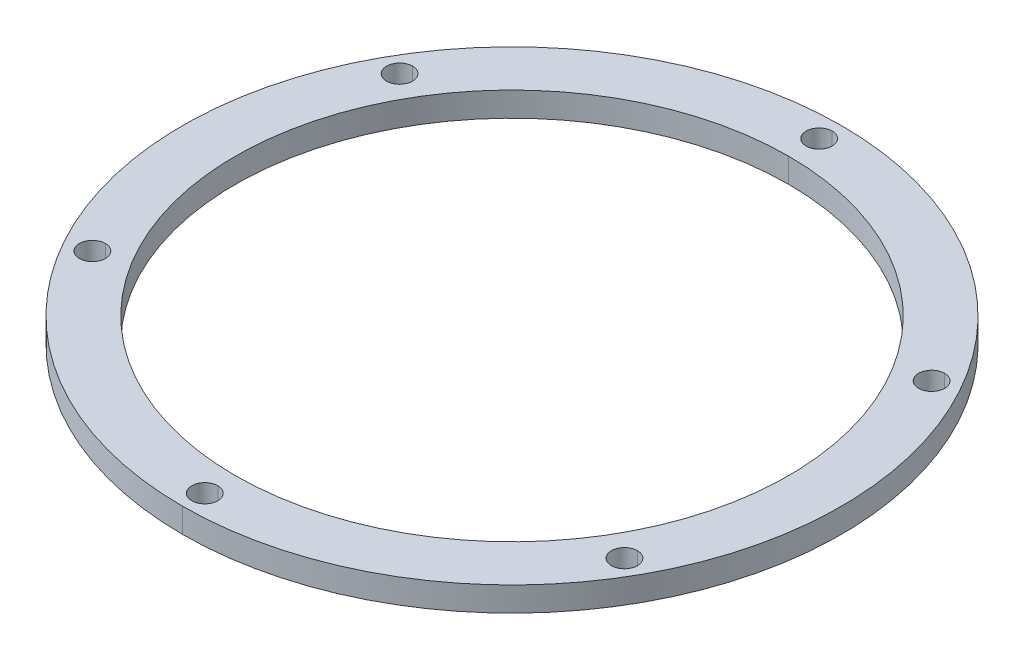
ISO-10303-21;
HEADER;
FILE_DESCRIPTION(('STEP AP214'),'2;1');
FILE_NAME('part.step','',(''),(''),'','','');
FILE_SCHEMA(('AUTOMOTIVE_DESIGN { 1 0 10303 214 1 1 1 1 }'));
ENDSEC;
DATA;
#1=APPLICATION_CONTEXT('core data for automotive mechanical design processes');
#2=APPLICATION_PROTOCOL_DEFINITION('international standard','automotive_design',2000,#1);
#3=PRODUCT_CONTEXT('',#1,'mechanical');
#4=PRODUCT('Part','Part','',(#3));
#5=PRODUCT_RELATED_PRODUCT_CATEGORY('part','',(#4));
#6=PRODUCT_DEFINITION_FORMATION('','',#4);
#7=PRODUCT_DEFINITION_CONTEXT('part definition',#1,'design');
#8=PRODUCT_DEFINITION('design','',#6,#7);
#9=PRODUCT_DEFINITION_SHAPE('','',#8);
#10=(LENGTH_UNIT() NAMED_UNIT(*) SI_UNIT(.MILLI.,.METRE.));
#11=(NAMED_UNIT(*) PLANE_ANGLE_UNIT() SI_UNIT($,.RADIAN.));
#12=(NAMED_UNIT(*) SI_UNIT($,.STERADIAN.) SOLID_ANGLE_UNIT());
#13=UNCERTAINTY_MEASURE_WITH_UNIT(LENGTH_MEASURE(1.E-05),#10,'distance_accuracy_value','');
#14=(GEOMETRIC_REPRESENTATION_CONTEXT(3) GLOBAL_UNCERTAINTY_ASSIGNED_CONTEXT((#13)) GLOBAL_UNIT_ASSIGNED_CONTEXT((#10,
#11,#12)) REPRESENTATION_CONTEXT('',''));
#15=CARTESIAN_POINT('',(0.,0.,0.));
#16=DIRECTION('',(0.,0.,1.));
#17=DIRECTION('',(1.,0.,0.));
#18=AXIS2_PLACEMENT_3D('',#15,#16,#17);
#19=CARTESIAN_POINT('',(-32.6924589928615,3.,-18.8749999999981));
#20=DIRECTION('',(0.,-1.,0.));
#21=DIRECTION('',(0.,0.,-1.));
#22=AXIS2_PLACEMENT_3D('',#19,#20,#21);
#23=CYLINDRICAL_SURFACE('',#22,1.600000000002);
#24=DIRECTION('',(0.,-1.,0.));
#25=VECTOR('',#24,1.);
#26=CARTESIAN_POINT('',(-32.6924589928615,3.,-17.2749999999961));
#27=LINE('',#26,#25);
#28=CARTESIAN_POINT('',(-32.6924589928615,3.,-17.2749999999961));
#29=VERTEX_POINT('',#28);
#30=CARTESIAN_POINT('',(-32.6924589928615,0.,-17.2749999999961));
#31=VERTEX_POINT('',#30);
#32=EDGE_CURVE('E240',#29,#31,#27,.T.);
#33=ORIENTED_EDGE('',*,*,#32,.F.);
#34=CARTESIAN_POINT('',(-32.6924589928615,3.,-18.8749999999981));
#35=DIRECTION('',(0.,1.,0.));
#36=DIRECTION('',(0.,0.,1.));
#37=AXIS2_PLACEMENT_3D('',#34,#35,#36);
#38=CIRCLE('',#37,1.600000000002);
#39=CARTESIAN_POINT('',(-32.6924589928615,3.,-20.475));
#40=VERTEX_POINT('',#39);
#41=EDGE_CURVE('E297',#29,#40,#38,.T.);
#42=ORIENTED_EDGE('',*,*,#41,.T.);
#43=DIRECTION('',(0.,-1.,0.));
#44=VECTOR('',#43,1.);
#45=CARTESIAN_POINT('',(-32.6924589928615,3.,-20.475));
#46=LINE('',#45,#44);
#47=CARTESIAN_POINT('',(-32.6924589928615,0.,-20.475));
#48=VERTEX_POINT('',#47);
#49=EDGE_CURVE('E249',#40,#48,#46,.T.);
#50=ORIENTED_EDGE('',*,*,#49,.T.);
#51=CARTESIAN_POINT('',(-32.6924589928615,0.,-18.8749999999981));
#52=DIRECTION('',(0.,1.,0.));
#53=DIRECTION('',(0.,0.,1.));
#54=AXIS2_PLACEMENT_3D('',#51,#52,#53);
#55=CIRCLE('',#54,1.600000000002);
#56=EDGE_CURVE('E10',#31,#48,#55,.T.);
#57=ORIENTED_EDGE('',*,*,#56,.F.);
#58=EDGE_LOOP('',(#33,#42,#50,#57));
#59=FACE_BOUND('',#58,.T.);
#60=ADVANCED_FACE('F15',(#59),#23,.F.);
#61=CARTESIAN_POINT('',(-32.6924589928594,3.,18.8750000000018));
#62=DIRECTION('',(0.,-1.,0.));
#63=DIRECTION('',(0.,0.,-1.));
#64=AXIS2_PLACEMENT_3D('',#61,#62,#63);
#65=CYLINDRICAL_SURFACE('',#64,1.60000000000396);
#66=DIRECTION('',(0.,-1.,0.));
#67=VECTOR('',#66,1.);
#68=CARTESIAN_POINT('',(-32.6924589928594,3.,20.4750000000058));
#69=LINE('',#68,#67);
#70=CARTESIAN_POINT('',(-32.6924589928594,3.,20.4750000000058));
#71=VERTEX_POINT('',#70);
#72=CARTESIAN_POINT('',(-32.6924589928594,0.,20.4750000000058));
#73=VERTEX_POINT('',#72);
#74=EDGE_CURVE('E248',#71,#73,#69,.T.);
#75=ORIENTED_EDGE('',*,*,#74,.F.);
#76=CARTESIAN_POINT('',(-32.6924589928594,3.,18.8750000000018));
#77=DIRECTION('',(0.,1.,0.));
#78=DIRECTION('',(0.,0.,1.));
#79=AXIS2_PLACEMENT_3D('',#76,#77,#78);
#80=CIRCLE('',#79,1.60000000000396);
#81=CARTESIAN_POINT('',(-32.6924589928594,3.,17.2749999999979));
#82=VERTEX_POINT('',#81);
#83=EDGE_CURVE('E76',#71,#82,#80,.T.);
#84=ORIENTED_EDGE('',*,*,#83,.T.);
#85=DIRECTION('',(0.,-1.,0.));
#86=VECTOR('',#85,1.);
#87=CARTESIAN_POINT('',(-32.6924589928594,3.,17.2749999999979));
#88=LINE('',#87,#86);
#89=CARTESIAN_POINT('',(-32.6924589928594,0.,17.2749999999979));
#90=VERTEX_POINT('',#89);
#91=EDGE_CURVE('E219',#82,#90,#88,.T.);
#92=ORIENTED_EDGE('',*,*,#91,.T.);
#93=CARTESIAN_POINT('',(-32.6924589928594,0.,18.8750000000018));
#94=DIRECTION('',(0.,1.,0.));
#95=DIRECTION('',(0.,0.,1.));
#96=AXIS2_PLACEMENT_3D('',#93,#94,#95);
#97=CIRCLE('',#96,1.60000000000396);
#98=EDGE_CURVE('E26',#73,#90,#97,.T.);
#99=ORIENTED_EDGE('',*,*,#98,.F.);
#100=EDGE_LOOP('',(#75,#84,#92,#99));
#101=FACE_BOUND('',#100,.T.);
#102=ADVANCED_FACE('F389',(#101),#65,.F.);
#103=CARTESIAN_POINT('',(4.27780899899066E-12,3.,37.75));
#104=DIRECTION('',(0.,-1.,0.));
#105=DIRECTION('',(0.,0.,-1.));
#106=AXIS2_PLACEMENT_3D('',#103,#104,#105);
#107=CYLINDRICAL_SURFACE('',#106,1.60000000000434);
#108=DIRECTION('',(0.,-1.,0.));
#109=VECTOR('',#108,1.);
#110=CARTESIAN_POINT('',(4.27800494247853E-12,3.,39.3500000000044));
#111=LINE('',#110,#109);
#112=CARTESIAN_POINT('',(4.27800494247853E-12,3.,39.3500000000044));
#113=VERTEX_POINT('',#112);
#114=CARTESIAN_POINT('',(4.27800494247853E-12,0.,39.3500000000044));
#115=VERTEX_POINT('',#114);
#116=EDGE_CURVE('E313',#113,#115,#111,.T.);
#117=ORIENTED_EDGE('',*,*,#116,.F.);
#118=CARTESIAN_POINT('',(4.27780899899066E-12,3.,37.75));
#119=DIRECTION('',(0.,1.,0.));
#120=DIRECTION('',(0.,0.,1.));
#121=AXIS2_PLACEMENT_3D('',#118,#119,#120);
#122=CIRCLE('',#121,1.60000000000434);
#123=CARTESIAN_POINT('',(4.27780899899066E-12,3.,36.1499999999957));
#124=VERTEX_POINT('',#123);
#125=EDGE_CURVE('E266',#113,#124,#122,.T.);
#126=ORIENTED_EDGE('',*,*,#125,.T.);
#127=DIRECTION('',(0.,-1.,0.));
#128=VECTOR('',#127,1.);
#129=CARTESIAN_POINT('',(4.27780899899066E-12,3.,36.1499999999957));
#130=LINE('',#129,#128);
#131=CARTESIAN_POINT('',(4.27780899899066E-12,0.,36.1499999999957));
#132=VERTEX_POINT('',#131);
#133=EDGE_CURVE('E210',#124,#132,#130,.T.);
#134=ORIENTED_EDGE('',*,*,#133,.T.);
#135=CARTESIAN_POINT('',(4.27780899899066E-12,0.,37.75));
#136=DIRECTION('',(0.,1.,0.));
#137=DIRECTION('',(0.,0.,1.));
#138=AXIS2_PLACEMENT_3D('',#135,#136,#137);
#139=CIRCLE('',#138,1.60000000000434);
#140=EDGE_CURVE('E241',#115,#132,#139,.T.);
#141=ORIENTED_EDGE('',*,*,#140,.F.);
#142=EDGE_LOOP('',(#117,#126,#134,#141));
#143=FACE_BOUND('',#142,.T.);
#144=ADVANCED_FACE('F396',(#143),#107,.F.);
#145=CARTESIAN_POINT('',(32.6924589928657,3.,18.8749999999981));
#146=DIRECTION('',(0.,-1.,0.));
#147=DIRECTION('',(0.,0.,-1.));
#148=AXIS2_PLACEMENT_3D('',#145,#146,#147);
#149=CYLINDRICAL_SURFACE('',#148,1.60000000000271);
#150=DIRECTION('',(0.,-1.,0.));
#151=VECTOR('',#150,1.);
#152=CARTESIAN_POINT('',(32.6924589928657,3.,20.4750000000009));
#153=LINE('',#152,#151);
#154=CARTESIAN_POINT('',(32.6924589928657,3.,20.4750000000009));
#155=VERTEX_POINT('',#154);
#156=CARTESIAN_POINT('',(32.6924589928657,0.,20.4750000000009));
#157=VERTEX_POINT('',#156);
#158=EDGE_CURVE('E198',#155,#157,#153,.T.);
#159=ORIENTED_EDGE('',*,*,#158,.F.);
#160=CARTESIAN_POINT('',(32.6924589928657,3.,18.8749999999981));
#161=DIRECTION('',(0.,1.,0.));
#162=DIRECTION('',(0.,0.,1.));
#163=AXIS2_PLACEMENT_3D('',#160,#161,#162);
#164=CIRCLE('',#163,1.60000000000271);
#165=CARTESIAN_POINT('',(32.6924589928657,3.,17.2749999999955));
#166=VERTEX_POINT('',#165);
#167=EDGE_CURVE('E186',#155,#166,#164,.T.);
#168=ORIENTED_EDGE('',*,*,#167,.T.);
#169=DIRECTION('',(0.,-1.,0.));
#170=VECTOR('',#169,1.);
#171=CARTESIAN_POINT('',(32.6924589928657,3.,17.2749999999955));
#172=LINE('',#171,#170);
#173=CARTESIAN_POINT('',(32.6924589928657,0.,17.2749999999955));
#174=VERTEX_POINT('',#173);
#175=EDGE_CURVE('E208',#166,#174,#172,.T.);
#176=ORIENTED_EDGE('',*,*,#175,.T.);
#177=CARTESIAN_POINT('',(32.6924589928657,0.,18.8749999999981));
#178=DIRECTION('',(0.,1.,0.));
#179=DIRECTION('',(0.,0.,1.));
#180=AXIS2_PLACEMENT_3D('',#177,#178,#179);
#181=CIRCLE('',#180,1.60000000000271);
#182=EDGE_CURVE('E200',#157,#174,#181,.T.);
#183=ORIENTED_EDGE('',*,*,#182,.F.);
#184=EDGE_LOOP('',(#159,#168,#176,#183));
#185=FACE_BOUND('',#184,.T.);
#186=ADVANCED_FACE('F199',(#185),#149,.F.);
#187=CARTESIAN_POINT('',(32.6924589928636,3.,-18.8750000000018));
#188=DIRECTION('',(0.,-1.,0.));
#189=DIRECTION('',(0.,0.,-1.));
#190=AXIS2_PLACEMENT_3D('',#187,#188,#189);
#191=CYLINDRICAL_SURFACE('',#190,1.60000000000058);
#192=DIRECTION('',(0.,-1.,0.));
#193=VECTOR('',#192,1.);
#194=CARTESIAN_POINT('',(32.6924589928636,3.,-17.2750000000013));
#195=LINE('',#194,#193);
#196=CARTESIAN_POINT('',(32.6924589928636,3.,-17.2750000000013));
#197=VERTEX_POINT('',#196);
#198=CARTESIAN_POINT('',(32.6924589928636,0.,-17.2750000000013));
#199=VERTEX_POINT('',#198);
#200=EDGE_CURVE('E232',#197,#199,#195,.T.);
#201=ORIENTED_EDGE('',*,*,#200,.F.);
#202=CARTESIAN_POINT('',(32.6924589928636,3.,-18.8750000000018));
#203=DIRECTION('',(0.,1.,0.));
#204=DIRECTION('',(0.,0.,1.));
#205=AXIS2_PLACEMENT_3D('',#202,#203,#204);
#206=CIRCLE('',#205,1.60000000000058);
#207=CARTESIAN_POINT('',(32.6924589928636,3.,-20.4750000000024));
#208=VERTEX_POINT('',#207);
#209=EDGE_CURVE('E235',#197,#208,#206,.T.);
#210=ORIENTED_EDGE('',*,*,#209,.T.);
#211=DIRECTION('',(0.,-1.,0.));
#212=VECTOR('',#211,1.);
#213=CARTESIAN_POINT('',(32.6924589928636,3.,-20.4750000000024));
#214=LINE('',#213,#212);
#215=CARTESIAN_POINT('',(32.6924589928636,0.,-20.4750000000024));
#216=VERTEX_POINT('',#215);
#217=EDGE_CURVE('E280',#208,#216,#214,.T.);
#218=ORIENTED_EDGE('',*,*,#217,.T.);
#219=CARTESIAN_POINT('',(32.6924589928636,0.,-18.8750000000018));
#220=DIRECTION('',(0.,1.,0.));
#221=DIRECTION('',(0.,0.,1.));
#222=AXIS2_PLACEMENT_3D('',#219,#220,#221);
#223=CIRCLE('',#222,1.60000000000058);
#224=EDGE_CURVE('E326',#199,#216,#223,.T.);
#225=ORIENTED_EDGE('',*,*,#224,.F.);
#226=EDGE_LOOP('',(#201,#210,#218,#225));
#227=FACE_BOUND('',#226,.T.);
#228=ADVANCED_FACE('F344',(#227),#191,.F.);
#229=CARTESIAN_POINT('',(0.,3.,-37.75));
#230=DIRECTION('',(0.,-1.,0.));
#231=DIRECTION('',(0.,0.,-1.));
#232=AXIS2_PLACEMENT_3D('',#229,#230,#231);
#233=CYLINDRICAL_SURFACE('',#232,1.6);
#234=DIRECTION('',(0.,-1.,0.));
#235=VECTOR('',#234,1.);
#236=CARTESIAN_POINT('',(0.,3.,-36.15));
#237=LINE('',#236,#235);
#238=CARTESIAN_POINT('',(0.,3.,-36.15));
#239=VERTEX_POINT('',#238);
#240=CARTESIAN_POINT('',(0.,0.,-36.15));
#241=VERTEX_POINT('',#240);
#242=EDGE_CURVE('E279',#239,#241,#237,.T.);
#243=ORIENTED_EDGE('',*,*,#242,.F.);
#244=CARTESIAN_POINT('',(0.,3.,-37.75));
#245=DIRECTION('',(0.,1.,0.));
#246=DIRECTION('',(0.,0.,1.));
#247=AXIS2_PLACEMENT_3D('',#244,#245,#246);
#248=CIRCLE('',#247,1.6);
#249=CARTESIAN_POINT('',(0.,3.,-39.35));
#250=VERTEX_POINT('',#249);
#251=EDGE_CURVE('E195',#239,#250,#248,.T.);
#252=ORIENTED_EDGE('',*,*,#251,.T.);
#253=DIRECTION('',(0.,-1.,0.));
#254=VECTOR('',#253,1.);
#255=CARTESIAN_POINT('',(0.,3.,-39.35));
#256=LINE('',#255,#254);
#257=CARTESIAN_POINT('',(0.,0.,-39.35));
#258=VERTEX_POINT('',#257);
#259=EDGE_CURVE('E289',#250,#258,#256,.T.);
#260=ORIENTED_EDGE('',*,*,#259,.T.);
#261=CARTESIAN_POINT('',(0.,0.,-37.75));
#262=DIRECTION('',(0.,1.,0.));
#263=DIRECTION('',(0.,0.,1.));
#264=AXIS2_PLACEMENT_3D('',#261,#262,#263);
#265=CIRCLE('',#264,1.6);
#266=EDGE_CURVE('E19',#241,#258,#265,.T.);
#267=ORIENTED_EDGE('',*,*,#266,.F.);
#268=EDGE_LOOP('',(#243,#252,#260,#267));
#269=FACE_BOUND('',#268,.T.);
#270=ADVANCED_FACE('F418',(#269),#233,.F.);
#271=CARTESIAN_POINT('',(0.,3.,0.));
#272=DIRECTION('',(0.,-1.,0.));
#273=DIRECTION('',(0.,0.,-1.));
#274=AXIS2_PLACEMENT_3D('',#271,#272,#273);
#275=CYLINDRICAL_SURFACE('',#274,34.);
#276=DIRECTION('',(0.,-1.,0.));
#277=VECTOR('',#276,1.);
#278=CARTESIAN_POINT('',(0.,3.,34.));
#279=LINE('',#278,#277);
#280=CARTESIAN_POINT('',(0.,3.,34.));
#281=VERTEX_POINT('',#280);
#282=CARTESIAN_POINT('',(0.,0.,34.));
#283=VERTEX_POINT('',#282);
#284=EDGE_CURVE('E258',#281,#283,#279,.T.);
#285=ORIENTED_EDGE('',*,*,#284,.F.);
#286=CARTESIAN_POINT('',(0.,3.,0.));
#287=DIRECTION('',(0.,1.,0.));
#288=DIRECTION('',(0.,0.,1.));
#289=AXIS2_PLACEMENT_3D('',#286,#287,#288);
#290=CIRCLE('',#289,34.);
#291=CARTESIAN_POINT('',(0.,3.,-34.));
#292=VERTEX_POINT('',#291);
#293=EDGE_CURVE('E110',#281,#292,#290,.T.);
#294=ORIENTED_EDGE('',*,*,#293,.T.);
#295=DIRECTION('',(0.,-1.,0.));
#296=VECTOR('',#295,1.);
#297=CARTESIAN_POINT('',(0.,3.,-34.));
#298=LINE('',#297,#296);
#299=CARTESIAN_POINT('',(0.,0.,-34.));
#300=VERTEX_POINT('',#299);
#301=EDGE_CURVE('E294',#292,#300,#298,.T.);
#302=ORIENTED_EDGE('',*,*,#301,.T.);
#303=CARTESIAN_POINT('',(0.,0.,0.));
#304=DIRECTION('',(0.,1.,0.));
#305=DIRECTION('',(0.,0.,1.));
#306=AXIS2_PLACEMENT_3D('',#303,#304,#305);
#307=CIRCLE('',#306,34.);
#308=EDGE_CURVE('E146',#283,#300,#307,.T.);
#309=ORIENTED_EDGE('',*,*,#308,.F.);
#310=EDGE_LOOP('',(#285,#294,#302,#309));
#311=FACE_BOUND('',#310,.T.);
#312=ADVANCED_FACE('F382',(#311),#275,.F.);
#313=CARTESIAN_POINT('',(0.,3.,0.));
#314=DIRECTION('',(0.,-1.,0.));
#315=DIRECTION('',(0.,0.,-1.));
#316=AXIS2_PLACEMENT_3D('',#313,#314,#315);
#317=CYLINDRICAL_SURFACE('',#316,40.5);
#318=DIRECTION('',(0.,-1.,0.));
#319=VECTOR('',#318,1.);
#320=CARTESIAN_POINT('',(0.,3.,40.5));
#321=LINE('',#320,#319);
#322=CARTESIAN_POINT('',(0.,3.,40.5));
#323=VERTEX_POINT('',#322);
#324=CARTESIAN_POINT('',(0.,0.,40.5));
#325=VERTEX_POINT('',#324);
#326=EDGE_CURVE('E222',#323,#325,#321,.T.);
#327=ORIENTED_EDGE('',*,*,#326,.F.);
#328=CARTESIAN_POINT('',(0.,3.,0.));
#329=DIRECTION('',(0.,1.,0.));
#330=DIRECTION('',(0.,0.,1.));
#331=AXIS2_PLACEMENT_3D('',#328,#329,#330);
#332=CIRCLE('',#331,40.5);
#333=CARTESIAN_POINT('',(0.,3.,-40.5));
#334=VERTEX_POINT('',#333);
#335=EDGE_CURVE('E274',#334,#323,#332,.T.);
#336=ORIENTED_EDGE('',*,*,#335,.F.);
#337=DIRECTION('',(0.,-1.,0.));
#338=VECTOR('',#337,1.);
#339=CARTESIAN_POINT('',(0.,3.,-40.5));
#340=LINE('',#339,#338);
#341=CARTESIAN_POINT('',(0.,0.,-40.5));
#342=VERTEX_POINT('',#341);
#343=EDGE_CURVE('E271',#334,#342,#340,.T.);
#344=ORIENTED_EDGE('',*,*,#343,.T.);
#345=CARTESIAN_POINT('',(0.,0.,0.));
#346=DIRECTION('',(0.,1.,0.));
#347=DIRECTION('',(0.,0.,1.));
#348=AXIS2_PLACEMENT_3D('',#345,#346,#347);
#349=CIRCLE('',#348,40.5);
#350=EDGE_CURVE('E39',#342,#325,#349,.T.);
#351=ORIENTED_EDGE('',*,*,#350,.T.);
#352=EDGE_LOOP('',(#327,#336,#344,#351));
#353=FACE_BOUND('',#352,.T.);
#354=ADVANCED_FACE('F371',(#353),#317,.T.);
#355=CARTESIAN_POINT('',(0.,0.,0.));
#356=DIRECTION('',(0.,1.,0.));
#357=DIRECTION('',(1.,0.,0.));
#358=AXIS2_PLACEMENT_3D('',#355,#356,#357);
#359=PLANE('',#358);
#360=CARTESIAN_POINT('',(-32.6924589928615,0.,-18.8749999999981));
#361=DIRECTION('',(0.,1.,0.));
#362=DIRECTION('',(0.,0.,1.));
#363=AXIS2_PLACEMENT_3D('',#360,#361,#362);
#364=CIRCLE('',#363,1.600000000002);
#365=EDGE_CURVE('E250',#48,#31,#364,.T.);
#366=ORIENTED_EDGE('',*,*,#365,.T.);
#367=ORIENTED_EDGE('',*,*,#56,.T.);
#368=EDGE_LOOP('',(#366,#367));
#369=FACE_BOUND('',#368,.T.);
#370=CARTESIAN_POINT('',(-32.6924589928594,0.,18.8750000000018));
#371=DIRECTION('',(0.,1.,0.));
#372=DIRECTION('',(0.,0.,1.));
#373=AXIS2_PLACEMENT_3D('',#370,#371,#372);
#374=CIRCLE('',#373,1.60000000000396);
#375=EDGE_CURVE('E257',#90,#73,#374,.T.);
#376=ORIENTED_EDGE('',*,*,#375,.T.);
#377=ORIENTED_EDGE('',*,*,#98,.T.);
#378=EDGE_LOOP('',(#376,#377));
#379=FACE_BOUND('',#378,.T.);
#380=CARTESIAN_POINT('',(4.27780899899066E-12,0.,37.75));
#381=DIRECTION('',(0.,1.,0.));
#382=DIRECTION('',(0.,0.,1.));
#383=AXIS2_PLACEMENT_3D('',#380,#381,#382);
#384=CIRCLE('',#383,1.60000000000434);
#385=EDGE_CURVE('E216',#132,#115,#384,.T.);
#386=ORIENTED_EDGE('',*,*,#385,.T.);
#387=ORIENTED_EDGE('',*,*,#140,.T.);
#388=EDGE_LOOP('',(#386,#387));
#389=FACE_BOUND('',#388,.T.);
#390=CARTESIAN_POINT('',(32.6924589928657,0.,18.8749999999981));
#391=DIRECTION('',(0.,1.,0.));
#392=DIRECTION('',(0.,0.,1.));
#393=AXIS2_PLACEMENT_3D('',#390,#391,#392);
#394=CIRCLE('',#393,1.60000000000271);
#395=EDGE_CURVE('E205',#174,#157,#394,.T.);
#396=ORIENTED_EDGE('',*,*,#395,.T.);
#397=ORIENTED_EDGE('',*,*,#182,.T.);
#398=EDGE_LOOP('',(#396,#397));
#399=FACE_BOUND('',#398,.T.);
#400=CARTESIAN_POINT('',(32.6924589928636,0.,-18.8750000000018));
#401=DIRECTION('',(0.,1.,0.));
#402=DIRECTION('',(0.,0.,1.));
#403=AXIS2_PLACEMENT_3D('',#400,#401,#402);
#404=CIRCLE('',#403,1.60000000000058);
#405=EDGE_CURVE('E293',#216,#199,#404,.T.);
#406=ORIENTED_EDGE('',*,*,#405,.T.);
#407=ORIENTED_EDGE('',*,*,#224,.T.);
#408=EDGE_LOOP('',(#406,#407));
#409=FACE_BOUND('',#408,.T.);
#410=CARTESIAN_POINT('',(0.,0.,-37.75));
#411=DIRECTION('',(0.,1.,0.));
#412=DIRECTION('',(0.,0.,1.));
#413=AXIS2_PLACEMENT_3D('',#410,#411,#412);
#414=CIRCLE('',#413,1.6);
#415=EDGE_CURVE('E302',#258,#241,#414,.T.);
#416=ORIENTED_EDGE('',*,*,#415,.T.);
#417=ORIENTED_EDGE('',*,*,#266,.T.);
#418=EDGE_LOOP('',(#416,#417));
#419=FACE_BOUND('',#418,.T.);
#420=CARTESIAN_POINT('',(0.,0.,0.));
#421=DIRECTION('',(0.,1.,0.));
#422=DIRECTION('',(0.,0.,1.));
#423=AXIS2_PLACEMENT_3D('',#420,#421,#422);
#424=CIRCLE('',#423,34.);
#425=EDGE_CURVE('E262',#300,#283,#424,.T.);
#426=ORIENTED_EDGE('',*,*,#425,.T.);
#427=ORIENTED_EDGE('',*,*,#308,.T.);
#428=EDGE_LOOP('',(#426,#427));
#429=FACE_BOUND('',#428,.T.);
#430=ORIENTED_EDGE('',*,*,#350,.F.);
#431=CARTESIAN_POINT('',(0.,0.,0.));
#432=DIRECTION('',(0.,1.,0.));
#433=DIRECTION('',(0.,0.,1.));
#434=AXIS2_PLACEMENT_3D('',#431,#432,#433);
#435=CIRCLE('',#434,40.5);
#436=EDGE_CURVE('E226',#325,#342,#435,.T.);
#437=ORIENTED_EDGE('',*,*,#436,.F.);
#438=EDGE_LOOP('',(#430,#437));
#439=FACE_BOUND('',#438,.T.);
#440=ADVANCED_FACE('F337',(#369,#379,#389,#399,#409,#419,#429,#439),#359,.F.);
#441=CARTESIAN_POINT('',(0.,3.,0.));
#442=DIRECTION('',(0.,1.,0.));
#443=DIRECTION('',(1.,0.,0.));
#444=AXIS2_PLACEMENT_3D('',#441,#442,#443);
#445=PLANE('',#444);
#446=CARTESIAN_POINT('',(-32.6924589928615,3.,-18.8749999999981));
#447=DIRECTION('',(0.,1.,0.));
#448=DIRECTION('',(0.,0.,1.));
#449=AXIS2_PLACEMENT_3D('',#446,#447,#448);
#450=CIRCLE('',#449,1.600000000002);
#451=EDGE_CURVE('E236',#40,#29,#450,.T.);
#452=ORIENTED_EDGE('',*,*,#451,.F.);
#453=ORIENTED_EDGE('',*,*,#41,.F.);
#454=EDGE_LOOP('',(#452,#453));
#455=FACE_BOUND('',#454,.T.);
#456=CARTESIAN_POINT('',(4.27780899899066E-12,3.,37.75));
#457=DIRECTION('',(0.,1.,0.));
#458=DIRECTION('',(0.,0.,1.));
#459=AXIS2_PLACEMENT_3D('',#456,#457,#458);
#460=CIRCLE('',#459,1.60000000000434);
#461=EDGE_CURVE('E314',#124,#113,#460,.T.);
#462=ORIENTED_EDGE('',*,*,#461,.F.);
#463=ORIENTED_EDGE('',*,*,#125,.F.);
#464=EDGE_LOOP('',(#462,#463));
#465=FACE_BOUND('',#464,.T.);
#466=CARTESIAN_POINT('',(32.6924589928636,3.,-18.8750000000018));
#467=DIRECTION('',(0.,1.,0.));
#468=DIRECTION('',(0.,0.,1.));
#469=AXIS2_PLACEMENT_3D('',#466,#467,#468);
#470=CIRCLE('',#469,1.60000000000058);
#471=EDGE_CURVE('E228',#208,#197,#470,.T.);
#472=ORIENTED_EDGE('',*,*,#471,.F.);
#473=ORIENTED_EDGE('',*,*,#209,.F.);
#474=EDGE_LOOP('',(#472,#473));
#475=FACE_BOUND('',#474,.T.);
#476=CARTESIAN_POINT('',(0.,3.,0.));
#477=DIRECTION('',(0.,1.,0.));
#478=DIRECTION('',(0.,0.,1.));
#479=AXIS2_PLACEMENT_3D('',#476,#477,#478);
#480=CIRCLE('',#479,34.);
#481=EDGE_CURVE('E263',#292,#281,#480,.T.);
#482=ORIENTED_EDGE('',*,*,#481,.F.);
#483=ORIENTED_EDGE('',*,*,#293,.F.);
#484=EDGE_LOOP('',(#482,#483));
#485=FACE_BOUND('',#484,.T.);
#486=CARTESIAN_POINT('',(0.,3.,-37.75));
#487=DIRECTION('',(0.,1.,0.));
#488=DIRECTION('',(0.,0.,1.));
#489=AXIS2_PLACEMENT_3D('',#486,#487,#488);
#490=CIRCLE('',#489,1.6);
#491=EDGE_CURVE('E275',#250,#239,#490,.T.);
#492=ORIENTED_EDGE('',*,*,#491,.F.);
#493=ORIENTED_EDGE('',*,*,#251,.F.);
#494=EDGE_LOOP('',(#492,#493));
#495=FACE_BOUND('',#494,.T.);
#496=CARTESIAN_POINT('',(32.6924589928657,3.,18.8749999999981));
#497=DIRECTION('',(0.,1.,0.));
#498=DIRECTION('',(0.,0.,1.));
#499=AXIS2_PLACEMENT_3D('',#496,#497,#498);
#500=CIRCLE('',#499,1.60000000000271);
#501=EDGE_CURVE('E190',#166,#155,#500,.T.);
#502=ORIENTED_EDGE('',*,*,#501,.F.);
#503=ORIENTED_EDGE('',*,*,#167,.F.);
#504=EDGE_LOOP('',(#502,#503));
#505=FACE_BOUND('',#504,.T.);
#506=CARTESIAN_POINT('',(-32.6924589928594,3.,18.8750000000018));
#507=DIRECTION('',(0.,1.,0.));
#508=DIRECTION('',(0.,0.,1.));
#509=AXIS2_PLACEMENT_3D('',#506,#507,#508);
#510=CIRCLE('',#509,1.60000000000396);
#511=EDGE_CURVE('E244',#82,#71,#510,.T.);
#512=ORIENTED_EDGE('',*,*,#511,.F.);
#513=ORIENTED_EDGE('',*,*,#83,.F.);
#514=EDGE_LOOP('',(#512,#513));
#515=FACE_BOUND('',#514,.T.);
#516=ORIENTED_EDGE('',*,*,#335,.T.);
#517=CARTESIAN_POINT('',(0.,3.,0.));
#518=DIRECTION('',(0.,1.,0.));
#519=DIRECTION('',(0.,0.,1.));
#520=AXIS2_PLACEMENT_3D('',#517,#518,#519);
#521=CIRCLE('',#520,40.5);
#522=EDGE_CURVE('E227',#323,#334,#521,.T.);
#523=ORIENTED_EDGE('',*,*,#522,.T.);
#524=EDGE_LOOP('',(#516,#523));
#525=FACE_BOUND('',#524,.T.);
#526=ADVANCED_FACE('F188',(#455,#465,#475,#485,#495,#505,#515,#525),#445,.T.);
#527=CARTESIAN_POINT('',(0.,3.,0.));
#528=DIRECTION('',(0.,-1.,0.));
#529=DIRECTION('',(0.,0.,-1.));
#530=AXIS2_PLACEMENT_3D('',#527,#528,#529);
#531=CYLINDRICAL_SURFACE('',#530,40.5);
#532=ORIENTED_EDGE('',*,*,#522,.F.);
#533=ORIENTED_EDGE('',*,*,#326,.T.);
#534=ORIENTED_EDGE('',*,*,#436,.T.);
#535=ORIENTED_EDGE('',*,*,#343,.F.);
#536=EDGE_LOOP('',(#532,#533,#534,#535));
#537=FACE_BOUND('',#536,.T.);
#538=ADVANCED_FACE('F367',(#537),#531,.T.);
#539=CARTESIAN_POINT('',(0.,3.,0.));
#540=DIRECTION('',(0.,-1.,0.));
#541=DIRECTION('',(0.,0.,-1.));
#542=AXIS2_PLACEMENT_3D('',#539,#540,#541);
#543=CYLINDRICAL_SURFACE('',#542,34.);
#544=ORIENTED_EDGE('',*,*,#481,.T.);
#545=ORIENTED_EDGE('',*,*,#284,.T.);
#546=ORIENTED_EDGE('',*,*,#425,.F.);
#547=ORIENTED_EDGE('',*,*,#301,.F.);
#548=EDGE_LOOP('',(#544,#545,#546,#547));
#549=FACE_BOUND('',#548,.T.);
#550=ADVANCED_FACE('F409',(#549),#543,.F.);
#551=CARTESIAN_POINT('',(0.,3.,-37.75));
#552=DIRECTION('',(0.,-1.,0.));
#553=DIRECTION('',(0.,0.,-1.));
#554=AXIS2_PLACEMENT_3D('',#551,#552,#553);
#555=CYLINDRICAL_SURFACE('',#554,1.6);
#556=ORIENTED_EDGE('',*,*,#491,.T.);
#557=ORIENTED_EDGE('',*,*,#242,.T.);
#558=ORIENTED_EDGE('',*,*,#415,.F.);
#559=ORIENTED_EDGE('',*,*,#259,.F.);
#560=EDGE_LOOP('',(#556,#557,#558,#559));
#561=FACE_BOUND('',#560,.T.);
#562=ADVANCED_FACE('F406',(#561),#555,.F.);
#563=CARTESIAN_POINT('',(32.6924589928636,3.,-18.8750000000018));
#564=DIRECTION('',(0.,-1.,0.));
#565=DIRECTION('',(0.,0.,-1.));
#566=AXIS2_PLACEMENT_3D('',#563,#564,#565);
#567=CYLINDRICAL_SURFACE('',#566,1.60000000000058);
#568=ORIENTED_EDGE('',*,*,#471,.T.);
#569=ORIENTED_EDGE('',*,*,#200,.T.);
#570=ORIENTED_EDGE('',*,*,#405,.F.);
#571=ORIENTED_EDGE('',*,*,#217,.F.);
#572=EDGE_LOOP('',(#568,#569,#570,#571));
#573=FACE_BOUND('',#572,.T.);
#574=ADVANCED_FACE('F341',(#573),#567,.F.);
#575=CARTESIAN_POINT('',(32.6924589928657,3.,18.8749999999981));
#576=DIRECTION('',(0.,-1.,0.));
#577=DIRECTION('',(0.,0.,-1.));
#578=AXIS2_PLACEMENT_3D('',#575,#576,#577);
#579=CYLINDRICAL_SURFACE('',#578,1.60000000000271);
#580=ORIENTED_EDGE('',*,*,#501,.T.);
#581=ORIENTED_EDGE('',*,*,#158,.T.);
#582=ORIENTED_EDGE('',*,*,#395,.F.);
#583=ORIENTED_EDGE('',*,*,#175,.F.);
#584=EDGE_LOOP('',(#580,#581,#582,#583));
#585=FACE_BOUND('',#584,.T.);
#586=ADVANCED_FACE('F207',(#585),#579,.F.);
#587=CARTESIAN_POINT('',(4.27780899899066E-12,3.,37.75));
#588=DIRECTION('',(0.,-1.,0.));
#589=DIRECTION('',(0.,0.,-1.));
#590=AXIS2_PLACEMENT_3D('',#587,#588,#589);
#591=CYLINDRICAL_SURFACE('',#590,1.60000000000434);
#592=ORIENTED_EDGE('',*,*,#461,.T.);
#593=ORIENTED_EDGE('',*,*,#116,.T.);
#594=ORIENTED_EDGE('',*,*,#385,.F.);
#595=ORIENTED_EDGE('',*,*,#133,.F.);
#596=EDGE_LOOP('',(#592,#593,#594,#595));
#597=FACE_BOUND('',#596,.T.);
#598=ADVANCED_FACE('F402',(#597),#591,.F.);
#599=CARTESIAN_POINT('',(-32.6924589928594,3.,18.8750000000018));
#600=DIRECTION('',(0.,-1.,0.));
#601=DIRECTION('',(0.,0.,-1.));
#602=AXIS2_PLACEMENT_3D('',#599,#600,#601);
#603=CYLINDRICAL_SURFACE('',#602,1.60000000000396);
#604=ORIENTED_EDGE('',*,*,#511,.T.);
#605=ORIENTED_EDGE('',*,*,#74,.T.);
#606=ORIENTED_EDGE('',*,*,#375,.F.);
#607=ORIENTED_EDGE('',*,*,#91,.F.);
#608=EDGE_LOOP('',(#604,#605,#606,#607));
#609=FACE_BOUND('',#608,.T.);
#610=ADVANCED_FACE('F399',(#609),#603,.F.);
#611=CARTESIAN_POINT('',(-32.6924589928615,3.,-18.8749999999981));
#612=DIRECTION('',(0.,-1.,0.));
#613=DIRECTION('',(0.,0.,-1.));
#614=AXIS2_PLACEMENT_3D('',#611,#612,#613);
#615=CYLINDRICAL_SURFACE('',#614,1.600000000002);
#616=ORIENTED_EDGE('',*,*,#451,.T.);
#617=ORIENTED_EDGE('',*,*,#32,.T.);
#618=ORIENTED_EDGE('',*,*,#365,.F.);
#619=ORIENTED_EDGE('',*,*,#49,.F.);
#620=EDGE_LOOP('',(#616,#617,#618,#619));
#621=FACE_BOUND('',#620,.T.);
#622=ADVANCED_FACE('F17',(#621),#615,.F.);
#623=CLOSED_SHELL('',(#60,#102,#144,#186,#228,#270,#312,#354,#440,#526,#538,#550,#562,#574,#586,
#598,#610,#622));
#624=MANIFOLD_SOLID_BREP('B1',#623);
#625=ADVANCED_BREP_SHAPE_REPRESENTATION('',(#18,#624),#14);
#626=SHAPE_DEFINITION_REPRESENTATION(#9,#625);
ENDSEC;
END-ISO-10303-21;
